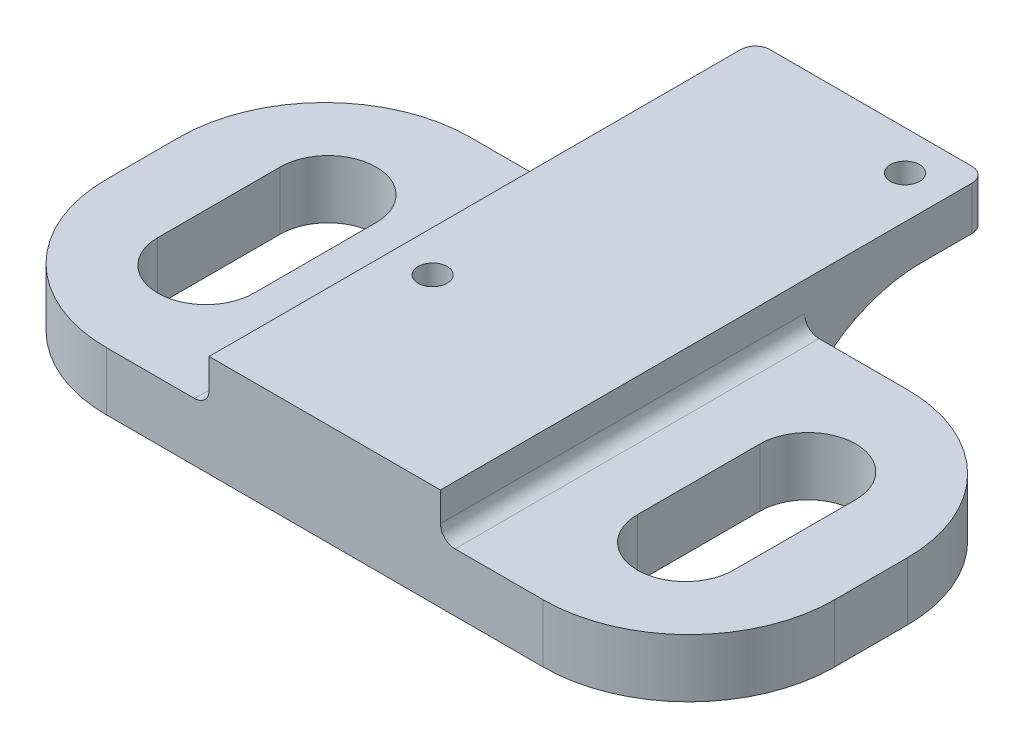
ISO-10303-21;
HEADER;
FILE_DESCRIPTION(('STEP AP214'),'2;1');
FILE_NAME('part.step','',(''),(''),'','','');
FILE_SCHEMA(('AUTOMOTIVE_DESIGN { 1 0 10303 214 1 1 1 1 }'));
ENDSEC;
DATA;
#1=APPLICATION_CONTEXT('core data for automotive mechanical design processes');
#2=APPLICATION_PROTOCOL_DEFINITION('international standard','automotive_design',2000,#1);
#3=PRODUCT_CONTEXT('',#1,'mechanical');
#4=PRODUCT('Part','Part','',(#3));
#5=PRODUCT_RELATED_PRODUCT_CATEGORY('part','',(#4));
#6=PRODUCT_DEFINITION_FORMATION('','',#4);
#7=PRODUCT_DEFINITION_CONTEXT('part definition',#1,'design');
#8=PRODUCT_DEFINITION('design','',#6,#7);
#9=PRODUCT_DEFINITION_SHAPE('','',#8);
#10=(LENGTH_UNIT() NAMED_UNIT(*) SI_UNIT(.MILLI.,.METRE.));
#11=(NAMED_UNIT(*) PLANE_ANGLE_UNIT() SI_UNIT($,.RADIAN.));
#12=(NAMED_UNIT(*) SI_UNIT($,.STERADIAN.) SOLID_ANGLE_UNIT());
#13=UNCERTAINTY_MEASURE_WITH_UNIT(LENGTH_MEASURE(1.E-05),#10,'distance_accuracy_value','');
#14=(GEOMETRIC_REPRESENTATION_CONTEXT(3) GLOBAL_UNCERTAINTY_ASSIGNED_CONTEXT((#13)) GLOBAL_UNIT_ASSIGNED_CONTEXT((#10,
#11,#12)) REPRESENTATION_CONTEXT('',''));
#15=CARTESIAN_POINT('',(0.,0.,0.));
#16=DIRECTION('',(0.,0.,1.));
#17=DIRECTION('',(1.,0.,0.));
#18=AXIS2_PLACEMENT_3D('',#15,#16,#17);
#19=CARTESIAN_POINT('',(0.,4.,-25.));
#20=DIRECTION('',(0.,0.,1.));
#21=DIRECTION('',(1.,0.,0.));
#22=AXIS2_PLACEMENT_3D('',#19,#20,#21);
#23=PLANE('',#22);
#24=DIRECTION('',(-1.,0.,0.));
#25=VECTOR('',#24,1.);
#26=CARTESIAN_POINT('',(0.,4.,-25.));
#27=LINE('',#26,#25);
#28=CARTESIAN_POINT('',(16.06,4.,-25.));
#29=VERTEX_POINT('',#28);
#30=CARTESIAN_POINT('',(10.,4.,-25.));
#31=VERTEX_POINT('',#30);
#32=EDGE_CURVE('E452',#29,#31,#27,.T.);
#33=ORIENTED_EDGE('',*,*,#32,.F.);
#34=CARTESIAN_POINT('',(16.06,5.,-25.));
#35=DIRECTION('',(0.,0.,1.));
#36=DIRECTION('',(1.,0.,0.));
#37=AXIS2_PLACEMENT_3D('',#34,#35,#36);
#38=CIRCLE('',#37,1.);
#39=CARTESIAN_POINT('',(17.06,5.,-25.));
#40=VERTEX_POINT('',#39);
#41=EDGE_CURVE('E13',#29,#40,#38,.T.);
#42=ORIENTED_EDGE('',*,*,#41,.T.);
#43=DIRECTION('',(0.,-1.,0.));
#44=VECTOR('',#43,1.);
#45=CARTESIAN_POINT('',(17.06,7.,-25.));
#46=LINE('',#45,#44);
#47=CARTESIAN_POINT('',(17.06,0.,-25.));
#48=VERTEX_POINT('',#47);
#49=EDGE_CURVE('E529',#40,#48,#46,.T.);
#50=ORIENTED_EDGE('',*,*,#49,.T.);
#51=DIRECTION('',(-1.,0.,0.));
#52=VECTOR('',#51,1.);
#53=CARTESIAN_POINT('',(0.,0.,-25.));
#54=LINE('',#53,#52);
#55=CARTESIAN_POINT('',(10.,0.,-25.));
#56=VERTEX_POINT('',#55);
#57=EDGE_CURVE('E465',#48,#56,#54,.T.);
#58=ORIENTED_EDGE('',*,*,#57,.T.);
#59=DIRECTION('',(0.,-1.,0.));
#60=VECTOR('',#59,1.);
#61=CARTESIAN_POINT('',(10.,4.,-25.));
#62=LINE('',#61,#60);
#63=EDGE_CURVE('E485',#56,#31,#62,.F.);
#64=ORIENTED_EDGE('',*,*,#63,.T.);
#65=EDGE_LOOP('',(#33,#42,#50,#58,#64));
#66=FACE_BOUND('',#65,.T.);
#67=ADVANCED_FACE('F181',(#66),#23,.F.);
#68=CARTESIAN_POINT('',(0.,4.,0.));
#69=DIRECTION('',(0.,-1.,0.));
#70=DIRECTION('',(0.,0.,-1.));
#71=AXIS2_PLACEMENT_3D('',#68,#69,#70);
#72=PLANE('',#71);
#73=DIRECTION('',(1.,0.,0.));
#74=VECTOR('',#73,1.);
#75=CARTESIAN_POINT('',(0.,4.,0.));
#76=LINE('',#75,#74);
#77=CARTESIAN_POINT('',(10.,4.,0.));
#78=VERTEX_POINT('',#77);
#79=CARTESIAN_POINT('',(16.06,4.,0.));
#80=VERTEX_POINT('',#79);
#81=EDGE_CURVE('E446',#78,#80,#76,.T.);
#82=ORIENTED_EDGE('',*,*,#81,.T.);
#83=DIRECTION('',(0.,0.,1.));
#84=VECTOR('',#83,1.);
#85=CARTESIAN_POINT('',(16.06,4.,-25.));
#86=LINE('',#85,#84);
#87=EDGE_CURVE('E549',#80,#29,#86,.F.);
#88=ORIENTED_EDGE('',*,*,#87,.T.);
#89=ORIENTED_EDGE('',*,*,#32,.T.);
#90=CARTESIAN_POINT('',(10.,4.,-15.));
#91=DIRECTION('',(0.,-1.,0.));
#92=DIRECTION('',(0.,0.,-1.));
#93=AXIS2_PLACEMENT_3D('',#90,#91,#92);
#94=CIRCLE('',#93,10.);
#95=CARTESIAN_POINT('',(0.,4.,-15.));
#96=VERTEX_POINT('',#95);
#97=EDGE_CURVE('E520',#31,#96,#94,.F.);
#98=ORIENTED_EDGE('',*,*,#97,.T.);
#99=DIRECTION('',(0.,0.,1.));
#100=VECTOR('',#99,1.);
#101=CARTESIAN_POINT('',(0.,4.,0.));
#102=LINE('',#101,#100);
#103=CARTESIAN_POINT('',(0.,4.,-10.));
#104=VERTEX_POINT('',#103);
#105=EDGE_CURVE('E441',#96,#104,#102,.T.);
#106=ORIENTED_EDGE('',*,*,#105,.T.);
#107=CARTESIAN_POINT('',(10.,4.,-10.));
#108=DIRECTION('',(0.,-1.,0.));
#109=DIRECTION('',(0.,0.,-1.));
#110=AXIS2_PLACEMENT_3D('',#107,#108,#109);
#111=CIRCLE('',#110,10.);
#112=EDGE_CURVE('E522',#104,#78,#111,.F.);
#113=ORIENTED_EDGE('',*,*,#112,.T.);
#114=EDGE_LOOP('',(#82,#88,#89,#98,#106,#113));
#115=FACE_BOUND('',#114,.T.);
#116=DIRECTION('',(0.,0.,-1.));
#117=VECTOR('',#116,1.);
#118=CARTESIAN_POINT('',(11.83,4.,-8.3));
#119=LINE('',#118,#117);
#120=CARTESIAN_POINT('',(11.83,4.,-8.3));
#121=VERTEX_POINT('',#120);
#122=CARTESIAN_POINT('',(11.83,4.,-16.7));
#123=VERTEX_POINT('',#122);
#124=EDGE_CURVE('E387',#121,#123,#119,.T.);
#125=ORIENTED_EDGE('',*,*,#124,.F.);
#126=CARTESIAN_POINT('',(8.53,4.,-8.3));
#127=DIRECTION('',(0.,1.,0.));
#128=DIRECTION('',(0.,0.,1.));
#129=AXIS2_PLACEMENT_3D('',#126,#127,#128);
#130=CIRCLE('',#129,3.3);
#131=CARTESIAN_POINT('',(5.22999999999998,4.,-8.3));
#132=VERTEX_POINT('',#131);
#133=EDGE_CURVE('E385',#132,#121,#130,.T.);
#134=ORIENTED_EDGE('',*,*,#133,.F.);
#135=DIRECTION('',(0.,0.,-1.));
#136=VECTOR('',#135,1.);
#137=CARTESIAN_POINT('',(5.23,4.,-8.3));
#138=LINE('',#137,#136);
#139=CARTESIAN_POINT('',(5.23,4.,-16.7));
#140=VERTEX_POINT('',#139);
#141=EDGE_CURVE('E367',#132,#140,#138,.T.);
#142=ORIENTED_EDGE('',*,*,#141,.T.);
#143=CARTESIAN_POINT('',(8.53,4.,-16.7));
#144=DIRECTION('',(0.,1.,0.));
#145=DIRECTION('',(0.,0.,1.));
#146=AXIS2_PLACEMENT_3D('',#143,#144,#145);
#147=CIRCLE('',#146,3.3);
#148=EDGE_CURVE('E374',#123,#140,#147,.T.);
#149=ORIENTED_EDGE('',*,*,#148,.F.);
#150=EDGE_LOOP('',(#125,#134,#142,#149));
#151=FACE_BOUND('',#150,.T.);
#152=ADVANCED_FACE('F384',(#115,#151),#72,.F.);
#153=CARTESIAN_POINT('',(40.,4.,-25.));
#154=VERTEX_POINT('',#153);
#155=CARTESIAN_POINT('',(33.94,4.,-25.));
#156=VERTEX_POINT('',#155);
#157=EDGE_CURVE('E453',#154,#156,#27,.T.);
#158=ORIENTED_EDGE('',*,*,#157,.T.);
#159=DIRECTION('',(0.,0.,-1.));
#160=VECTOR('',#159,1.);
#161=CARTESIAN_POINT('',(33.94,4.,0.));
#162=LINE('',#161,#160);
#163=CARTESIAN_POINT('',(33.94,4.,0.));
#164=VERTEX_POINT('',#163);
#165=EDGE_CURVE('E541',#156,#164,#162,.F.);
#166=ORIENTED_EDGE('',*,*,#165,.T.);
#167=CARTESIAN_POINT('',(40.,4.,0.));
#168=VERTEX_POINT('',#167);
#169=EDGE_CURVE('E444',#164,#168,#76,.T.);
#170=ORIENTED_EDGE('',*,*,#169,.T.);
#171=CARTESIAN_POINT('',(40.,4.,-10.));
#172=DIRECTION('',(0.,-1.,0.));
#173=DIRECTION('',(0.,0.,-1.));
#174=AXIS2_PLACEMENT_3D('',#171,#172,#173);
#175=CIRCLE('',#174,10.);
#176=CARTESIAN_POINT('',(50.,4.,-10.));
#177=VERTEX_POINT('',#176);
#178=EDGE_CURVE('E505',#168,#177,#175,.F.);
#179=ORIENTED_EDGE('',*,*,#178,.T.);
#180=DIRECTION('',(0.,0.,-1.));
#181=VECTOR('',#180,1.);
#182=CARTESIAN_POINT('',(50.,4.,0.));
#183=LINE('',#182,#181);
#184=CARTESIAN_POINT('',(50.,4.,-15.));
#185=VERTEX_POINT('',#184);
#186=EDGE_CURVE('E449',#177,#185,#183,.T.);
#187=ORIENTED_EDGE('',*,*,#186,.T.);
#188=CARTESIAN_POINT('',(40.,4.,-15.));
#189=DIRECTION('',(0.,-1.,0.));
#190=DIRECTION('',(0.,0.,-1.));
#191=AXIS2_PLACEMENT_3D('',#188,#189,#190);
#192=CIRCLE('',#191,10.);
#193=EDGE_CURVE('E507',#185,#154,#192,.F.);
#194=ORIENTED_EDGE('',*,*,#193,.T.);
#195=EDGE_LOOP('',(#158,#166,#170,#179,#187,#194));
#196=FACE_BOUND('',#195,.T.);
#197=DIRECTION('',(0.,0.,-1.));
#198=VECTOR('',#197,1.);
#199=CARTESIAN_POINT('',(44.77,4.,-8.3));
#200=LINE('',#199,#198);
#201=CARTESIAN_POINT('',(44.77,4.,-8.3));
#202=VERTEX_POINT('',#201);
#203=CARTESIAN_POINT('',(44.77,4.,-16.7));
#204=VERTEX_POINT('',#203);
#205=EDGE_CURVE('E373',#202,#204,#200,.T.);
#206=ORIENTED_EDGE('',*,*,#205,.F.);
#207=CARTESIAN_POINT('',(41.47,4.,-8.3));
#208=DIRECTION('',(0.,1.,0.));
#209=DIRECTION('',(0.,0.,1.));
#210=AXIS2_PLACEMENT_3D('',#207,#208,#209);
#211=CIRCLE('',#210,3.3);
#212=CARTESIAN_POINT('',(38.17,4.,-8.3));
#213=VERTEX_POINT('',#212);
#214=EDGE_CURVE('E406',#213,#202,#211,.T.);
#215=ORIENTED_EDGE('',*,*,#214,.F.);
#216=DIRECTION('',(0.,0.,-1.));
#217=VECTOR('',#216,1.);
#218=CARTESIAN_POINT('',(38.17,4.,-8.3));
#219=LINE('',#218,#217);
#220=CARTESIAN_POINT('',(38.17,4.,-16.7));
#221=VERTEX_POINT('',#220);
#222=EDGE_CURVE('E400',#213,#221,#219,.T.);
#223=ORIENTED_EDGE('',*,*,#222,.T.);
#224=CARTESIAN_POINT('',(41.47,4.,-16.7));
#225=DIRECTION('',(0.,1.,0.));
#226=DIRECTION('',(0.,0.,1.));
#227=AXIS2_PLACEMENT_3D('',#224,#225,#226);
#228=CIRCLE('',#227,3.3);
#229=EDGE_CURVE('E414',#204,#221,#228,.T.);
#230=ORIENTED_EDGE('',*,*,#229,.F.);
#231=EDGE_LOOP('',(#206,#215,#223,#230));
#232=FACE_BOUND('',#231,.T.);
#233=ADVANCED_FACE('F611',(#196,#232),#72,.F.);
#234=CARTESIAN_POINT('',(0.,4.,0.));
#235=DIRECTION('',(1.,0.,0.));
#236=DIRECTION('',(0.,0.,-1.));
#237=AXIS2_PLACEMENT_3D('',#234,#235,#236);
#238=PLANE('',#237);
#239=DIRECTION('',(0.,0.,1.));
#240=VECTOR('',#239,1.);
#241=CARTESIAN_POINT('',(0.,0.,0.));
#242=LINE('',#241,#240);
#243=CARTESIAN_POINT('',(0.,0.,-15.));
#244=VERTEX_POINT('',#243);
#245=CARTESIAN_POINT('',(0.,0.,-10.));
#246=VERTEX_POINT('',#245);
#247=EDGE_CURVE('E440',#244,#246,#242,.T.);
#248=ORIENTED_EDGE('',*,*,#247,.T.);
#249=DIRECTION('',(0.,-1.,0.));
#250=VECTOR('',#249,1.);
#251=CARTESIAN_POINT('',(0.,4.,-10.));
#252=LINE('',#251,#250);
#253=EDGE_CURVE('E518',#246,#104,#252,.F.);
#254=ORIENTED_EDGE('',*,*,#253,.T.);
#255=ORIENTED_EDGE('',*,*,#105,.F.);
#256=DIRECTION('',(0.,-1.,0.));
#257=VECTOR('',#256,1.);
#258=CARTESIAN_POINT('',(0.,4.,-15.));
#259=LINE('',#258,#257);
#260=EDGE_CURVE('E515',#96,#244,#259,.T.);
#261=ORIENTED_EDGE('',*,*,#260,.T.);
#262=EDGE_LOOP('',(#248,#254,#255,#261));
#263=FACE_BOUND('',#262,.T.);
#264=ADVANCED_FACE('F587',(#263),#238,.F.);
#265=CARTESIAN_POINT('',(0.,4.,0.));
#266=DIRECTION('',(0.,0.,-1.));
#267=DIRECTION('',(-1.,0.,0.));
#268=AXIS2_PLACEMENT_3D('',#265,#266,#267);
#269=PLANE('',#268);
#270=DIRECTION('',(1.,0.,0.));
#271=VECTOR('',#270,1.);
#272=CARTESIAN_POINT('',(0.,0.,0.));
#273=LINE('',#272,#271);
#274=CARTESIAN_POINT('',(10.,0.,0.));
#275=VERTEX_POINT('',#274);
#276=CARTESIAN_POINT('',(40.,0.,0.));
#277=VERTEX_POINT('',#276);
#278=EDGE_CURVE('E459',#275,#277,#273,.T.);
#279=ORIENTED_EDGE('',*,*,#278,.T.);
#280=DIRECTION('',(0.,-1.,0.));
#281=VECTOR('',#280,1.);
#282=CARTESIAN_POINT('',(40.,4.,0.));
#283=LINE('',#282,#281);
#284=EDGE_CURVE('E512',#277,#168,#283,.F.);
#285=ORIENTED_EDGE('',*,*,#284,.T.);
#286=ORIENTED_EDGE('',*,*,#169,.F.);
#287=CARTESIAN_POINT('',(33.94,5.,0.));
#288=DIRECTION('',(0.,0.,-1.));
#289=DIRECTION('',(-1.,0.,0.));
#290=AXIS2_PLACEMENT_3D('',#287,#288,#289);
#291=CIRCLE('',#290,1.);
#292=CARTESIAN_POINT('',(32.94,5.,0.));
#293=VERTEX_POINT('',#292);
#294=EDGE_CURVE('E564',#164,#293,#291,.T.);
#295=ORIENTED_EDGE('',*,*,#294,.T.);
#296=DIRECTION('',(0.,-1.,0.));
#297=VECTOR('',#296,1.);
#298=CARTESIAN_POINT('',(32.94,7.,0.));
#299=LINE('',#298,#297);
#300=CARTESIAN_POINT('',(32.94,7.,0.));
#301=VERTEX_POINT('',#300);
#302=EDGE_CURVE('E429',#301,#293,#299,.T.);
#303=ORIENTED_EDGE('',*,*,#302,.F.);
#304=DIRECTION('',(1.,0.,0.));
#305=VECTOR('',#304,1.);
#306=CARTESIAN_POINT('',(17.06,7.,0.));
#307=LINE('',#306,#305);
#308=CARTESIAN_POINT('',(17.06,7.,0.));
#309=VERTEX_POINT('',#308);
#310=EDGE_CURVE('E422',#309,#301,#307,.T.);
#311=ORIENTED_EDGE('',*,*,#310,.F.);
#312=DIRECTION('',(0.,-1.,0.));
#313=VECTOR('',#312,1.);
#314=CARTESIAN_POINT('',(17.06,7.,0.));
#315=LINE('',#314,#313);
#316=CARTESIAN_POINT('',(17.06,5.,0.));
#317=VERTEX_POINT('',#316);
#318=EDGE_CURVE('E437',#309,#317,#315,.T.);
#319=ORIENTED_EDGE('',*,*,#318,.T.);
#320=CARTESIAN_POINT('',(16.06,5.,0.));
#321=DIRECTION('',(0.,0.,-1.));
#322=DIRECTION('',(-1.,0.,0.));
#323=AXIS2_PLACEMENT_3D('',#320,#321,#322);
#324=CIRCLE('',#323,1.);
#325=EDGE_CURVE('E189',#317,#80,#324,.T.);
#326=ORIENTED_EDGE('',*,*,#325,.T.);
#327=ORIENTED_EDGE('',*,*,#81,.F.);
#328=DIRECTION('',(0.,-1.,0.));
#329=VECTOR('',#328,1.);
#330=CARTESIAN_POINT('',(10.,4.,0.));
#331=LINE('',#330,#329);
#332=EDGE_CURVE('E509',#78,#275,#331,.T.);
#333=ORIENTED_EDGE('',*,*,#332,.T.);
#334=EDGE_LOOP('',(#279,#285,#286,#295,#303,#311,#319,#326,#327,#333));
#335=FACE_BOUND('',#334,.T.);
#336=ADVANCED_FACE('F567',(#335),#269,.F.);
#337=CARTESIAN_POINT('',(50.,4.,0.));
#338=DIRECTION('',(-1.,0.,0.));
#339=DIRECTION('',(0.,0.,1.));
#340=AXIS2_PLACEMENT_3D('',#337,#338,#339);
#341=PLANE('',#340);
#342=DIRECTION('',(0.,0.,-1.));
#343=VECTOR('',#342,1.);
#344=CARTESIAN_POINT('',(50.,0.,0.));
#345=LINE('',#344,#343);
#346=CARTESIAN_POINT('',(50.,0.,-10.));
#347=VERTEX_POINT('',#346);
#348=CARTESIAN_POINT('',(50.,0.,-15.));
#349=VERTEX_POINT('',#348);
#350=EDGE_CURVE('E462',#347,#349,#345,.T.);
#351=ORIENTED_EDGE('',*,*,#350,.T.);
#352=DIRECTION('',(0.,-1.,0.));
#353=VECTOR('',#352,1.);
#354=CARTESIAN_POINT('',(50.,4.,-15.));
#355=LINE('',#354,#353);
#356=EDGE_CURVE('E503',#349,#185,#355,.F.);
#357=ORIENTED_EDGE('',*,*,#356,.T.);
#358=ORIENTED_EDGE('',*,*,#186,.F.);
#359=DIRECTION('',(0.,-1.,0.));
#360=VECTOR('',#359,1.);
#361=CARTESIAN_POINT('',(50.,4.,-10.));
#362=LINE('',#361,#360);
#363=EDGE_CURVE('E500',#177,#347,#362,.T.);
#364=ORIENTED_EDGE('',*,*,#363,.T.);
#365=EDGE_LOOP('',(#351,#357,#358,#364));
#366=FACE_BOUND('',#365,.T.);
#367=ADVANCED_FACE('F607',(#366),#341,.F.);
#368=CARTESIAN_POINT('',(40.,0.,-25.));
#369=VERTEX_POINT('',#368);
#370=CARTESIAN_POINT('',(32.94,0.,-25.));
#371=VERTEX_POINT('',#370);
#372=EDGE_CURVE('E445',#369,#371,#54,.T.);
#373=ORIENTED_EDGE('',*,*,#372,.T.);
#374=DIRECTION('',(0.,1.,0.));
#375=VECTOR('',#374,1.);
#376=CARTESIAN_POINT('',(32.94,7.,-25.));
#377=LINE('',#376,#375);
#378=CARTESIAN_POINT('',(32.94,5.,-25.));
#379=VERTEX_POINT('',#378);
#380=EDGE_CURVE('E527',#371,#379,#377,.T.);
#381=ORIENTED_EDGE('',*,*,#380,.T.);
#382=CARTESIAN_POINT('',(33.94,5.,-25.));
#383=DIRECTION('',(0.,0.,1.));
#384=DIRECTION('',(1.,0.,0.));
#385=AXIS2_PLACEMENT_3D('',#382,#383,#384);
#386=CIRCLE('',#385,1.);
#387=EDGE_CURVE('E562',#379,#156,#386,.T.);
#388=ORIENTED_EDGE('',*,*,#387,.T.);
#389=ORIENTED_EDGE('',*,*,#157,.F.);
#390=DIRECTION('',(0.,-1.,0.));
#391=VECTOR('',#390,1.);
#392=CARTESIAN_POINT('',(40.,4.,-25.));
#393=LINE('',#392,#391);
#394=EDGE_CURVE('E488',#154,#369,#393,.T.);
#395=ORIENTED_EDGE('',*,*,#394,.T.);
#396=EDGE_LOOP('',(#373,#381,#388,#389,#395));
#397=FACE_BOUND('',#396,.T.);
#398=ADVANCED_FACE('F618',(#397),#23,.F.);
#399=CARTESIAN_POINT('',(0.,0.,0.));
#400=DIRECTION('',(0.,-1.,0.));
#401=DIRECTION('',(0.,0.,-1.));
#402=AXIS2_PLACEMENT_3D('',#399,#400,#401);
#403=PLANE('',#402);
#404=CARTESIAN_POINT('',(19.8800000000001,0.,-12.5250000000001));
#405=DIRECTION('',(0.,-1.,0.));
#406=DIRECTION('',(0.,0.,-1.));
#407=AXIS2_PLACEMENT_3D('',#404,#405,#406);
#408=CIRCLE('',#407,0.999999999999999);
#409=CARTESIAN_POINT('',(19.8800000000001,0.,-13.5250000000001));
#410=VERTEX_POINT('',#409);
#411=EDGE_CURVE('E390',#410,#410,#408,.T.);
#412=ORIENTED_EDGE('',*,*,#411,.F.);
#413=EDGE_LOOP('',(#412));
#414=FACE_BOUND('',#413,.T.);
#415=DIRECTION('',(0.,0.,-1.));
#416=VECTOR('',#415,1.);
#417=CARTESIAN_POINT('',(5.23000000000001,0.,0.));
#418=LINE('',#417,#416);
#419=CARTESIAN_POINT('',(5.23,0.,-8.3));
#420=VERTEX_POINT('',#419);
#421=CARTESIAN_POINT('',(5.23,0.,-16.7));
#422=VERTEX_POINT('',#421);
#423=EDGE_CURVE('E370',#420,#422,#418,.T.);
#424=ORIENTED_EDGE('',*,*,#423,.F.);
#425=CARTESIAN_POINT('',(8.53,0.,-8.3));
#426=DIRECTION('',(0.,-1.,0.));
#427=DIRECTION('',(0.,0.,-1.));
#428=AXIS2_PLACEMENT_3D('',#425,#426,#427);
#429=CIRCLE('',#428,3.3);
#430=CARTESIAN_POINT('',(11.83,0.,-8.3));
#431=VERTEX_POINT('',#430);
#432=EDGE_CURVE('E480',#431,#420,#429,.T.);
#433=ORIENTED_EDGE('',*,*,#432,.F.);
#434=DIRECTION('',(0.,0.,1.));
#435=VECTOR('',#434,1.);
#436=CARTESIAN_POINT('',(11.83,0.,0.));
#437=LINE('',#436,#435);
#438=CARTESIAN_POINT('',(11.83,0.,-16.7));
#439=VERTEX_POINT('',#438);
#440=EDGE_CURVE('E477',#439,#431,#437,.T.);
#441=ORIENTED_EDGE('',*,*,#440,.F.);
#442=CARTESIAN_POINT('',(8.53,0.,-16.7));
#443=DIRECTION('',(0.,-1.,0.));
#444=DIRECTION('',(0.,0.,-1.));
#445=AXIS2_PLACEMENT_3D('',#442,#443,#444);
#446=CIRCLE('',#445,3.3);
#447=EDGE_CURVE('E482',#422,#439,#446,.T.);
#448=ORIENTED_EDGE('',*,*,#447,.F.);
#449=EDGE_LOOP('',(#424,#433,#441,#448));
#450=FACE_BOUND('',#449,.T.);
#451=DIRECTION('',(0.,0.,-1.));
#452=VECTOR('',#451,1.);
#453=CARTESIAN_POINT('',(38.17,0.,0.));
#454=LINE('',#453,#452);
#455=CARTESIAN_POINT('',(38.17,0.,-8.3));
#456=VERTEX_POINT('',#455);
#457=CARTESIAN_POINT('',(38.17,0.,-16.7));
#458=VERTEX_POINT('',#457);
#459=EDGE_CURVE('E474',#456,#458,#454,.T.);
#460=ORIENTED_EDGE('',*,*,#459,.F.);
#461=CARTESIAN_POINT('',(41.47,0.,-8.3));
#462=DIRECTION('',(0.,-1.,0.));
#463=DIRECTION('',(0.,0.,-1.));
#464=AXIS2_PLACEMENT_3D('',#461,#462,#463);
#465=CIRCLE('',#464,3.3);
#466=CARTESIAN_POINT('',(44.77,0.,-8.3));
#467=VERTEX_POINT('',#466);
#468=EDGE_CURVE('E470',#467,#456,#465,.T.);
#469=ORIENTED_EDGE('',*,*,#468,.F.);
#470=DIRECTION('',(0.,0.,1.));
#471=VECTOR('',#470,1.);
#472=CARTESIAN_POINT('',(44.77,0.,0.));
#473=LINE('',#472,#471);
#474=CARTESIAN_POINT('',(44.77,0.,-16.7));
#475=VERTEX_POINT('',#474);
#476=EDGE_CURVE('E456',#475,#467,#473,.T.);
#477=ORIENTED_EDGE('',*,*,#476,.F.);
#478=CARTESIAN_POINT('',(41.47,0.,-16.7));
#479=DIRECTION('',(0.,-1.,0.));
#480=DIRECTION('',(0.,0.,-1.));
#481=AXIS2_PLACEMENT_3D('',#478,#479,#480);
#482=CIRCLE('',#481,3.3);
#483=EDGE_CURVE('E472',#458,#475,#482,.T.);
#484=ORIENTED_EDGE('',*,*,#483,.F.);
#485=EDGE_LOOP('',(#460,#469,#477,#484));
#486=FACE_BOUND('',#485,.T.);
#487=ORIENTED_EDGE('',*,*,#372,.F.);
#488=CARTESIAN_POINT('',(40.,0.,-15.));
#489=DIRECTION('',(0.,-1.,0.));
#490=DIRECTION('',(0.,0.,-1.));
#491=AXIS2_PLACEMENT_3D('',#488,#489,#490);
#492=CIRCLE('',#491,10.);
#493=EDGE_CURVE('E498',#369,#349,#492,.T.);
#494=ORIENTED_EDGE('',*,*,#493,.T.);
#495=ORIENTED_EDGE('',*,*,#350,.F.);
#496=CARTESIAN_POINT('',(40.,0.,-10.));
#497=DIRECTION('',(0.,-1.,0.));
#498=DIRECTION('',(0.,0.,-1.));
#499=AXIS2_PLACEMENT_3D('',#496,#497,#498);
#500=CIRCLE('',#499,10.);
#501=EDGE_CURVE('E496',#347,#277,#500,.T.);
#502=ORIENTED_EDGE('',*,*,#501,.T.);
#503=ORIENTED_EDGE('',*,*,#278,.F.);
#504=CARTESIAN_POINT('',(10.,0.,-10.));
#505=DIRECTION('',(0.,-1.,0.));
#506=DIRECTION('',(0.,0.,-1.));
#507=AXIS2_PLACEMENT_3D('',#504,#505,#506);
#508=CIRCLE('',#507,10.);
#509=EDGE_CURVE('E494',#275,#246,#508,.T.);
#510=ORIENTED_EDGE('',*,*,#509,.T.);
#511=ORIENTED_EDGE('',*,*,#247,.F.);
#512=CARTESIAN_POINT('',(10.,0.,-15.));
#513=DIRECTION('',(0.,-1.,0.));
#514=DIRECTION('',(0.,0.,-1.));
#515=AXIS2_PLACEMENT_3D('',#512,#513,#514);
#516=CIRCLE('',#515,10.);
#517=EDGE_CURVE('E491',#244,#56,#516,.T.);
#518=ORIENTED_EDGE('',*,*,#517,.T.);
#519=ORIENTED_EDGE('',*,*,#57,.F.);
#520=EDGE_CURVE('E468',#371,#48,#54,.T.);
#521=ORIENTED_EDGE('',*,*,#520,.F.);
#522=EDGE_LOOP('',(#487,#494,#495,#502,#503,#510,#511,#518,#519,#521));
#523=FACE_BOUND('',#522,.T.);
#524=ADVANCED_FACE('F593',(#414,#450,#486,#523),#403,.T.);
#525=CARTESIAN_POINT('',(0.,4.,0.));
#526=DIRECTION('',(0.,1.,0.));
#527=DIRECTION('',(0.,0.,1.));
#528=AXIS2_PLACEMENT_3D('',#525,#526,#527);
#529=PLANE('',#528);
#530=CARTESIAN_POINT('',(30.0400000000001,4.,-34.8000000000001));
#531=DIRECTION('',(0.,1.,0.));
#532=DIRECTION('',(0.,0.,1.));
#533=AXIS2_PLACEMENT_3D('',#530,#531,#532);
#534=CIRCLE('',#533,0.999999999999999);
#535=CARTESIAN_POINT('',(30.0400000000001,4.,-33.8000000000001));
#536=VERTEX_POINT('',#535);
#537=EDGE_CURVE('E929',#536,#536,#534,.T.);
#538=ORIENTED_EDGE('',*,*,#537,.T.);
#539=EDGE_LOOP('',(#538));
#540=FACE_BOUND('',#539,.T.);
#541=DIRECTION('',(-1.,0.,0.));
#542=VECTOR('',#541,1.);
#543=CARTESIAN_POINT('',(17.06,4.,-37.5));
#544=LINE('',#543,#542);
#545=CARTESIAN_POINT('',(31.94,4.,-37.5));
#546=VERTEX_POINT('',#545);
#547=CARTESIAN_POINT('',(18.06,4.,-37.5));
#548=VERTEX_POINT('',#547);
#549=EDGE_CURVE('E423',#546,#548,#544,.T.);
#550=ORIENTED_EDGE('',*,*,#549,.F.);
#551=CARTESIAN_POINT('',(31.94,4.,-36.5));
#552=DIRECTION('',(0.,1.,0.));
#553=DIRECTION('',(0.,0.,1.));
#554=AXIS2_PLACEMENT_3D('',#551,#552,#553);
#555=CIRCLE('',#554,1.);
#556=CARTESIAN_POINT('',(32.94,4.,-36.5));
#557=VERTEX_POINT('',#556);
#558=EDGE_CURVE('E557',#546,#557,#555,.F.);
#559=ORIENTED_EDGE('',*,*,#558,.T.);
#560=DIRECTION('',(0.,0.,-1.));
#561=VECTOR('',#560,1.);
#562=CARTESIAN_POINT('',(32.94,4.,-37.5));
#563=LINE('',#562,#561);
#564=CARTESIAN_POINT('',(32.94,4.,-33.));
#565=VERTEX_POINT('',#564);
#566=EDGE_CURVE('E431',#565,#557,#563,.T.);
#567=ORIENTED_EDGE('',*,*,#566,.F.);
#568=DIRECTION('',(1.,0.,0.));
#569=VECTOR('',#568,1.);
#570=CARTESIAN_POINT('',(0.,4.,-33.));
#571=LINE('',#570,#569);
#572=CARTESIAN_POINT('',(17.06,4.,-33.));
#573=VERTEX_POINT('',#572);
#574=EDGE_CURVE('E524',#565,#573,#571,.F.);
#575=ORIENTED_EDGE('',*,*,#574,.T.);
#576=DIRECTION('',(0.,0.,1.));
#577=VECTOR('',#576,1.);
#578=CARTESIAN_POINT('',(17.06,4.,-37.5));
#579=LINE('',#578,#577);
#580=CARTESIAN_POINT('',(17.06,4.,-36.5));
#581=VERTEX_POINT('',#580);
#582=EDGE_CURVE('E419',#581,#573,#579,.T.);
#583=ORIENTED_EDGE('',*,*,#582,.F.);
#584=CARTESIAN_POINT('',(18.06,4.,-36.5));
#585=DIRECTION('',(0.,1.,0.));
#586=DIRECTION('',(0.,0.,1.));
#587=AXIS2_PLACEMENT_3D('',#584,#585,#586);
#588=CIRCLE('',#587,1.);
#589=EDGE_CURVE('E555',#581,#548,#588,.F.);
#590=ORIENTED_EDGE('',*,*,#589,.T.);
#591=EDGE_LOOP('',(#550,#559,#567,#575,#583,#590));
#592=FACE_BOUND('',#591,.T.);
#593=ADVANCED_FACE('F630',(#540,#592),#529,.F.);
#594=CARTESIAN_POINT('',(17.06,7.,-37.5));
#595=DIRECTION('',(1.,0.,0.));
#596=DIRECTION('',(0.,0.,-1.));
#597=AXIS2_PLACEMENT_3D('',#594,#595,#596);
#598=PLANE('',#597);
#599=ORIENTED_EDGE('',*,*,#49,.F.);
#600=DIRECTION('',(0.,0.,1.));
#601=VECTOR('',#600,1.);
#602=CARTESIAN_POINT('',(17.06,5.,0.));
#603=LINE('',#602,#601);
#604=EDGE_CURVE('E546',#40,#317,#603,.T.);
#605=ORIENTED_EDGE('',*,*,#604,.T.);
#606=ORIENTED_EDGE('',*,*,#318,.F.);
#607=DIRECTION('',(0.,0.,1.));
#608=VECTOR('',#607,1.);
#609=CARTESIAN_POINT('',(17.06,7.,-37.5));
#610=LINE('',#609,#608);
#611=CARTESIAN_POINT('',(17.06,7.,-36.5));
#612=VERTEX_POINT('',#611);
#613=EDGE_CURVE('E420',#612,#309,#610,.T.);
#614=ORIENTED_EDGE('',*,*,#613,.F.);
#615=DIRECTION('',(0.,-1.,0.));
#616=VECTOR('',#615,1.);
#617=CARTESIAN_POINT('',(17.06,7.,-36.5));
#618=LINE('',#617,#616);
#619=EDGE_CURVE('E543',#612,#581,#618,.T.);
#620=ORIENTED_EDGE('',*,*,#619,.T.);
#621=ORIENTED_EDGE('',*,*,#582,.T.);
#622=CARTESIAN_POINT('',(17.06,-6.,-33.));
#623=DIRECTION('',(1.,0.,0.));
#624=DIRECTION('',(0.,0.,-1.));
#625=AXIS2_PLACEMENT_3D('',#622,#623,#624);
#626=CIRCLE('',#625,10.);
#627=EDGE_CURVE('E532',#573,#48,#626,.T.);
#628=ORIENTED_EDGE('',*,*,#627,.T.);
#629=EDGE_LOOP('',(#599,#605,#606,#614,#620,#621,#628));
#630=FACE_BOUND('',#629,.T.);
#631=ADVANCED_FACE('F642',(#630),#598,.F.);
#632=CARTESIAN_POINT('',(32.94,7.,-37.5));
#633=DIRECTION('',(-1.,0.,0.));
#634=DIRECTION('',(0.,0.,1.));
#635=AXIS2_PLACEMENT_3D('',#632,#633,#634);
#636=PLANE('',#635);
#637=ORIENTED_EDGE('',*,*,#302,.T.);
#638=DIRECTION('',(0.,0.,-1.));
#639=VECTOR('',#638,1.);
#640=CARTESIAN_POINT('',(32.94,5.,-25.));
#641=LINE('',#640,#639);
#642=EDGE_CURVE('E538',#293,#379,#641,.T.);
#643=ORIENTED_EDGE('',*,*,#642,.T.);
#644=ORIENTED_EDGE('',*,*,#380,.F.);
#645=CARTESIAN_POINT('',(32.94,-6.,-33.));
#646=DIRECTION('',(-1.,0.,0.));
#647=DIRECTION('',(0.,0.,1.));
#648=AXIS2_PLACEMENT_3D('',#645,#646,#647);
#649=CIRCLE('',#648,10.);
#650=EDGE_CURVE('E534',#371,#565,#649,.T.);
#651=ORIENTED_EDGE('',*,*,#650,.T.);
#652=ORIENTED_EDGE('',*,*,#566,.T.);
#653=DIRECTION('',(0.,-1.,0.));
#654=VECTOR('',#653,1.);
#655=CARTESIAN_POINT('',(32.94,7.,-36.5));
#656=LINE('',#655,#654);
#657=CARTESIAN_POINT('',(32.94,7.,-36.5));
#658=VERTEX_POINT('',#657);
#659=EDGE_CURVE('E536',#557,#658,#656,.F.);
#660=ORIENTED_EDGE('',*,*,#659,.T.);
#661=DIRECTION('',(0.,0.,-1.));
#662=VECTOR('',#661,1.);
#663=CARTESIAN_POINT('',(32.94,7.,-37.5));
#664=LINE('',#663,#662);
#665=EDGE_CURVE('E425',#301,#658,#664,.T.);
#666=ORIENTED_EDGE('',*,*,#665,.F.);
#667=EDGE_LOOP('',(#637,#643,#644,#651,#652,#660,#666));
#668=FACE_BOUND('',#667,.T.);
#669=ADVANCED_FACE('F626',(#668),#636,.F.);
#670=CARTESIAN_POINT('',(17.06,7.,-37.5));
#671=DIRECTION('',(0.,0.,1.));
#672=DIRECTION('',(1.,0.,0.));
#673=AXIS2_PLACEMENT_3D('',#670,#671,#672);
#674=PLANE('',#673);
#675=DIRECTION('',(-1.,0.,0.));
#676=VECTOR('',#675,1.);
#677=CARTESIAN_POINT('',(17.06,7.,-37.5));
#678=LINE('',#677,#676);
#679=CARTESIAN_POINT('',(31.94,7.,-37.5));
#680=VERTEX_POINT('',#679);
#681=CARTESIAN_POINT('',(18.06,7.,-37.5));
#682=VERTEX_POINT('',#681);
#683=EDGE_CURVE('E427',#680,#682,#678,.T.);
#684=ORIENTED_EDGE('',*,*,#683,.F.);
#685=DIRECTION('',(0.,-1.,0.));
#686=VECTOR('',#685,1.);
#687=CARTESIAN_POINT('',(31.94,7.,-37.5));
#688=LINE('',#687,#686);
#689=EDGE_CURVE('E552',#680,#546,#688,.T.);
#690=ORIENTED_EDGE('',*,*,#689,.T.);
#691=ORIENTED_EDGE('',*,*,#549,.T.);
#692=DIRECTION('',(0.,-1.,0.));
#693=VECTOR('',#692,1.);
#694=CARTESIAN_POINT('',(18.06,7.,-37.5));
#695=LINE('',#694,#693);
#696=EDGE_CURVE('E196',#548,#682,#695,.F.);
#697=ORIENTED_EDGE('',*,*,#696,.T.);
#698=EDGE_LOOP('',(#684,#690,#691,#697));
#699=FACE_BOUND('',#698,.T.);
#700=ADVANCED_FACE('F635',(#699),#674,.F.);
#701=CARTESIAN_POINT('',(0.,7.,0.));
#702=DIRECTION('',(0.,1.,0.));
#703=DIRECTION('',(0.,0.,1.));
#704=AXIS2_PLACEMENT_3D('',#701,#702,#703);
#705=PLANE('',#704);
#706=CARTESIAN_POINT('',(30.0400000000001,7.,-34.8000000000001));
#707=DIRECTION('',(0.,1.,0.));
#708=DIRECTION('',(0.,0.,1.));
#709=AXIS2_PLACEMENT_3D('',#706,#707,#708);
#710=CIRCLE('',#709,1.);
#711=CARTESIAN_POINT('',(30.0400000000001,7.,-33.8000000000001));
#712=VERTEX_POINT('',#711);
#713=EDGE_CURVE('E931',#712,#712,#710,.T.);
#714=ORIENTED_EDGE('',*,*,#713,.F.);
#715=EDGE_LOOP('',(#714));
#716=FACE_BOUND('',#715,.T.);
#717=CARTESIAN_POINT('',(19.8800000000001,7.,-12.5250000000001));
#718=DIRECTION('',(0.,1.,0.));
#719=DIRECTION('',(0.,0.,1.));
#720=AXIS2_PLACEMENT_3D('',#717,#718,#719);
#721=CIRCLE('',#720,1.);
#722=CARTESIAN_POINT('',(19.8800000000001,7.,-11.5250000000001));
#723=VERTEX_POINT('',#722);
#724=EDGE_CURVE('E930',#723,#723,#721,.T.);
#725=ORIENTED_EDGE('',*,*,#724,.F.);
#726=EDGE_LOOP('',(#725));
#727=FACE_BOUND('',#726,.T.);
#728=ORIENTED_EDGE('',*,*,#665,.T.);
#729=CARTESIAN_POINT('',(31.94,7.,-36.5));
#730=DIRECTION('',(0.,1.,0.));
#731=DIRECTION('',(0.,0.,1.));
#732=AXIS2_PLACEMENT_3D('',#729,#730,#731);
#733=CIRCLE('',#732,1.);
#734=EDGE_CURVE('E203',#658,#680,#733,.T.);
#735=ORIENTED_EDGE('',*,*,#734,.T.);
#736=ORIENTED_EDGE('',*,*,#683,.T.);
#737=CARTESIAN_POINT('',(18.06,7.,-36.5));
#738=DIRECTION('',(0.,1.,0.));
#739=DIRECTION('',(0.,0.,1.));
#740=AXIS2_PLACEMENT_3D('',#737,#738,#739);
#741=CIRCLE('',#740,1.);
#742=EDGE_CURVE('E559',#682,#612,#741,.T.);
#743=ORIENTED_EDGE('',*,*,#742,.T.);
#744=ORIENTED_EDGE('',*,*,#613,.T.);
#745=ORIENTED_EDGE('',*,*,#310,.T.);
#746=EDGE_LOOP('',(#728,#735,#736,#743,#744,#745));
#747=FACE_BOUND('',#746,.T.);
#748=ADVANCED_FACE('F637',(#716,#727,#747),#705,.T.);
#749=CARTESIAN_POINT('',(41.47,4.,-16.7));
#750=DIRECTION('',(0.,1.,0.));
#751=DIRECTION('',(0.,0.,1.));
#752=AXIS2_PLACEMENT_3D('',#749,#750,#751);
#753=CYLINDRICAL_SURFACE('',#752,3.3);
#754=ORIENTED_EDGE('',*,*,#483,.T.);
#755=DIRECTION('',(0.,-1.,0.));
#756=VECTOR('',#755,1.);
#757=CARTESIAN_POINT('',(44.77,-0.00100000000000013,-16.7));
#758=LINE('',#757,#756);
#759=EDGE_CURVE('E411',#204,#475,#758,.T.);
#760=ORIENTED_EDGE('',*,*,#759,.F.);
#761=ORIENTED_EDGE('',*,*,#229,.T.);
#762=DIRECTION('',(0.,1.,0.));
#763=VECTOR('',#762,1.);
#764=CARTESIAN_POINT('',(38.17,4.,-16.7));
#765=LINE('',#764,#763);
#766=EDGE_CURVE('E417',#458,#221,#765,.T.);
#767=ORIENTED_EDGE('',*,*,#766,.F.);
#768=EDGE_LOOP('',(#754,#760,#761,#767));
#769=FACE_BOUND('',#768,.T.);
#770=ADVANCED_FACE('F778',(#769),#753,.F.);
#771=CARTESIAN_POINT('',(41.47,4.,-8.3));
#772=DIRECTION('',(0.,1.,0.));
#773=DIRECTION('',(0.,0.,1.));
#774=AXIS2_PLACEMENT_3D('',#771,#772,#773);
#775=CYLINDRICAL_SURFACE('',#774,3.3);
#776=ORIENTED_EDGE('',*,*,#468,.T.);
#777=DIRECTION('',(0.,1.,0.));
#778=VECTOR('',#777,1.);
#779=CARTESIAN_POINT('',(38.17,4.,-8.3));
#780=LINE('',#779,#778);
#781=EDGE_CURVE('E408',#213,#456,#780,.F.);
#782=ORIENTED_EDGE('',*,*,#781,.F.);
#783=ORIENTED_EDGE('',*,*,#214,.T.);
#784=DIRECTION('',(0.,-1.,0.));
#785=VECTOR('',#784,1.);
#786=CARTESIAN_POINT('',(44.77,-0.00100000000000013,-8.3));
#787=LINE('',#786,#785);
#788=EDGE_CURVE('E403',#202,#467,#787,.T.);
#789=ORIENTED_EDGE('',*,*,#788,.T.);
#790=EDGE_LOOP('',(#776,#782,#783,#789));
#791=FACE_BOUND('',#790,.T.);
#792=ADVANCED_FACE('F774',(#791),#775,.F.);
#793=CARTESIAN_POINT('',(38.17,4.,-8.3));
#794=DIRECTION('',(-1.,0.,0.));
#795=DIRECTION('',(0.,0.,1.));
#796=AXIS2_PLACEMENT_3D('',#793,#794,#795);
#797=PLANE('',#796);
#798=ORIENTED_EDGE('',*,*,#459,.T.);
#799=ORIENTED_EDGE('',*,*,#766,.T.);
#800=ORIENTED_EDGE('',*,*,#222,.F.);
#801=ORIENTED_EDGE('',*,*,#781,.T.);
#802=EDGE_LOOP('',(#798,#799,#800,#801));
#803=FACE_BOUND('',#802,.T.);
#804=ADVANCED_FACE('F770',(#803),#797,.F.);
#805=CARTESIAN_POINT('',(44.77,-0.00100000000000013,-8.3));
#806=DIRECTION('',(1.,0.,0.));
#807=DIRECTION('',(0.,1.,0.));
#808=AXIS2_PLACEMENT_3D('',#805,#806,#807);
#809=PLANE('',#808);
#810=ORIENTED_EDGE('',*,*,#476,.T.);
#811=ORIENTED_EDGE('',*,*,#788,.F.);
#812=ORIENTED_EDGE('',*,*,#205,.T.);
#813=ORIENTED_EDGE('',*,*,#759,.T.);
#814=EDGE_LOOP('',(#810,#811,#812,#813));
#815=FACE_BOUND('',#814,.T.);
#816=ADVANCED_FACE('F767',(#815),#809,.F.);
#817=CARTESIAN_POINT('',(8.53,4.,-16.7));
#818=DIRECTION('',(0.,1.,0.));
#819=DIRECTION('',(0.,0.,1.));
#820=AXIS2_PLACEMENT_3D('',#817,#818,#819);
#821=CYLINDRICAL_SURFACE('',#820,3.3);
#822=ORIENTED_EDGE('',*,*,#447,.T.);
#823=DIRECTION('',(0.,-1.,0.));
#824=VECTOR('',#823,1.);
#825=CARTESIAN_POINT('',(11.83,-0.00100000000000013,-16.7));
#826=LINE('',#825,#824);
#827=EDGE_CURVE('E380',#123,#439,#826,.T.);
#828=ORIENTED_EDGE('',*,*,#827,.F.);
#829=ORIENTED_EDGE('',*,*,#148,.T.);
#830=DIRECTION('',(0.,1.,0.));
#831=VECTOR('',#830,1.);
#832=CARTESIAN_POINT('',(5.23,4.,-16.7));
#833=LINE('',#832,#831);
#834=EDGE_CURVE('E362',#422,#140,#833,.T.);
#835=ORIENTED_EDGE('',*,*,#834,.F.);
#836=EDGE_LOOP('',(#822,#828,#829,#835));
#837=FACE_BOUND('',#836,.T.);
#838=ADVANCED_FACE('F378',(#837),#821,.F.);
#839=CARTESIAN_POINT('',(8.53,4.,-8.3));
#840=DIRECTION('',(0.,1.,0.));
#841=DIRECTION('',(0.,0.,1.));
#842=AXIS2_PLACEMENT_3D('',#839,#840,#841);
#843=CYLINDRICAL_SURFACE('',#842,3.3);
#844=ORIENTED_EDGE('',*,*,#432,.T.);
#845=DIRECTION('',(0.,1.,0.));
#846=VECTOR('',#845,1.);
#847=CARTESIAN_POINT('',(5.23,4.,-8.3));
#848=LINE('',#847,#846);
#849=EDGE_CURVE('E395',#132,#420,#848,.F.);
#850=ORIENTED_EDGE('',*,*,#849,.F.);
#851=ORIENTED_EDGE('',*,*,#133,.T.);
#852=DIRECTION('',(0.,-1.,0.));
#853=VECTOR('',#852,1.);
#854=CARTESIAN_POINT('',(11.83,-0.00100000000000013,-8.3));
#855=LINE('',#854,#853);
#856=EDGE_CURVE('E386',#121,#431,#855,.T.);
#857=ORIENTED_EDGE('',*,*,#856,.T.);
#858=EDGE_LOOP('',(#844,#850,#851,#857));
#859=FACE_BOUND('',#858,.T.);
#860=ADVANCED_FACE('F761',(#859),#843,.F.);
#861=CARTESIAN_POINT('',(5.23,4.,-8.3));
#862=DIRECTION('',(-1.,0.,0.));
#863=DIRECTION('',(0.,0.,1.));
#864=AXIS2_PLACEMENT_3D('',#861,#862,#863);
#865=PLANE('',#864);
#866=ORIENTED_EDGE('',*,*,#423,.T.);
#867=ORIENTED_EDGE('',*,*,#834,.T.);
#868=ORIENTED_EDGE('',*,*,#141,.F.);
#869=ORIENTED_EDGE('',*,*,#849,.T.);
#870=EDGE_LOOP('',(#866,#867,#868,#869));
#871=FACE_BOUND('',#870,.T.);
#872=ADVANCED_FACE('F364',(#871),#865,.F.);
#873=CARTESIAN_POINT('',(11.83,-0.00100000000000013,-8.3));
#874=DIRECTION('',(1.,0.,0.));
#875=DIRECTION('',(0.,0.,-1.));
#876=AXIS2_PLACEMENT_3D('',#873,#874,#875);
#877=PLANE('',#876);
#878=ORIENTED_EDGE('',*,*,#440,.T.);
#879=ORIENTED_EDGE('',*,*,#856,.F.);
#880=ORIENTED_EDGE('',*,*,#124,.T.);
#881=ORIENTED_EDGE('',*,*,#827,.T.);
#882=EDGE_LOOP('',(#878,#879,#880,#881));
#883=FACE_BOUND('',#882,.T.);
#884=ADVANCED_FACE('F687',(#883),#877,.F.);
#885=CARTESIAN_POINT('',(40.,4.,-15.));
#886=DIRECTION('',(0.,-1.,0.));
#887=DIRECTION('',(0.,0.,-1.));
#888=AXIS2_PLACEMENT_3D('',#885,#886,#887);
#889=CYLINDRICAL_SURFACE('',#888,10.);
#890=ORIENTED_EDGE('',*,*,#193,.F.);
#891=ORIENTED_EDGE('',*,*,#356,.F.);
#892=ORIENTED_EDGE('',*,*,#493,.F.);
#893=ORIENTED_EDGE('',*,*,#394,.F.);
#894=EDGE_LOOP('',(#890,#891,#892,#893));
#895=FACE_BOUND('',#894,.T.);
#896=ADVANCED_FACE('F616',(#895),#889,.T.);
#897=CARTESIAN_POINT('',(40.,4.,-10.));
#898=DIRECTION('',(0.,-1.,0.));
#899=DIRECTION('',(0.,0.,-1.));
#900=AXIS2_PLACEMENT_3D('',#897,#898,#899);
#901=CYLINDRICAL_SURFACE('',#900,10.);
#902=ORIENTED_EDGE('',*,*,#178,.F.);
#903=ORIENTED_EDGE('',*,*,#284,.F.);
#904=ORIENTED_EDGE('',*,*,#501,.F.);
#905=ORIENTED_EDGE('',*,*,#363,.F.);
#906=EDGE_LOOP('',(#902,#903,#904,#905));
#907=FACE_BOUND('',#906,.T.);
#908=ADVANCED_FACE('F604',(#907),#901,.T.);
#909=CARTESIAN_POINT('',(10.,4.,-10.));
#910=DIRECTION('',(0.,-1.,0.));
#911=DIRECTION('',(0.,0.,-1.));
#912=AXIS2_PLACEMENT_3D('',#909,#910,#911);
#913=CYLINDRICAL_SURFACE('',#912,10.);
#914=ORIENTED_EDGE('',*,*,#112,.F.);
#915=ORIENTED_EDGE('',*,*,#253,.F.);
#916=ORIENTED_EDGE('',*,*,#509,.F.);
#917=ORIENTED_EDGE('',*,*,#332,.F.);
#918=EDGE_LOOP('',(#914,#915,#916,#917));
#919=FACE_BOUND('',#918,.T.);
#920=ADVANCED_FACE('F598',(#919),#913,.T.);
#921=CARTESIAN_POINT('',(10.,4.,-15.));
#922=DIRECTION('',(0.,-1.,0.));
#923=DIRECTION('',(0.,0.,-1.));
#924=AXIS2_PLACEMENT_3D('',#921,#922,#923);
#925=CYLINDRICAL_SURFACE('',#924,10.);
#926=ORIENTED_EDGE('',*,*,#97,.F.);
#927=ORIENTED_EDGE('',*,*,#63,.F.);
#928=ORIENTED_EDGE('',*,*,#517,.F.);
#929=ORIENTED_EDGE('',*,*,#260,.F.);
#930=EDGE_LOOP('',(#926,#927,#928,#929));
#931=FACE_BOUND('',#930,.T.);
#932=ADVANCED_FACE('F590',(#931),#925,.T.);
#933=CARTESIAN_POINT('',(0.,-6.,-33.));
#934=DIRECTION('',(1.,0.,0.));
#935=DIRECTION('',(0.,0.,-1.));
#936=AXIS2_PLACEMENT_3D('',#933,#934,#935);
#937=CYLINDRICAL_SURFACE('',#936,10.);
#938=ORIENTED_EDGE('',*,*,#650,.F.);
#939=ORIENTED_EDGE('',*,*,#520,.T.);
#940=ORIENTED_EDGE('',*,*,#627,.F.);
#941=ORIENTED_EDGE('',*,*,#574,.F.);
#942=EDGE_LOOP('',(#938,#939,#940,#941));
#943=FACE_BOUND('',#942,.T.);
#944=ADVANCED_FACE('F622',(#943),#937,.F.);
#945=CARTESIAN_POINT('',(33.94,5.,-37.5));
#946=DIRECTION('',(0.,0.,1.));
#947=DIRECTION('',(1.,0.,0.));
#948=AXIS2_PLACEMENT_3D('',#945,#946,#947);
#949=CYLINDRICAL_SURFACE('',#948,1.);
#950=ORIENTED_EDGE('',*,*,#294,.F.);
#951=ORIENTED_EDGE('',*,*,#165,.F.);
#952=ORIENTED_EDGE('',*,*,#387,.F.);
#953=ORIENTED_EDGE('',*,*,#642,.F.);
#954=EDGE_LOOP('',(#950,#951,#952,#953));
#955=FACE_BOUND('',#954,.T.);
#956=ADVANCED_FACE('F650',(#955),#949,.F.);
#957=CARTESIAN_POINT('',(16.06,5.,-37.5));
#958=DIRECTION('',(0.,0.,-1.));
#959=DIRECTION('',(-1.,0.,0.));
#960=AXIS2_PLACEMENT_3D('',#957,#958,#959);
#961=CYLINDRICAL_SURFACE('',#960,1.);
#962=ORIENTED_EDGE('',*,*,#41,.F.);
#963=ORIENTED_EDGE('',*,*,#87,.F.);
#964=ORIENTED_EDGE('',*,*,#325,.F.);
#965=ORIENTED_EDGE('',*,*,#604,.F.);
#966=EDGE_LOOP('',(#962,#963,#964,#965));
#967=FACE_BOUND('',#966,.T.);
#968=ADVANCED_FACE('F578',(#967),#961,.F.);
#969=CARTESIAN_POINT('',(31.94,7.,-36.5));
#970=DIRECTION('',(0.,-1.,0.));
#971=DIRECTION('',(0.,0.,-1.));
#972=AXIS2_PLACEMENT_3D('',#969,#970,#971);
#973=CYLINDRICAL_SURFACE('',#972,1.);
#974=ORIENTED_EDGE('',*,*,#734,.F.);
#975=ORIENTED_EDGE('',*,*,#659,.F.);
#976=ORIENTED_EDGE('',*,*,#558,.F.);
#977=ORIENTED_EDGE('',*,*,#689,.F.);
#978=EDGE_LOOP('',(#974,#975,#976,#977));
#979=FACE_BOUND('',#978,.T.);
#980=ADVANCED_FACE('F634',(#979),#973,.T.);
#981=CARTESIAN_POINT('',(18.06,7.,-36.5));
#982=DIRECTION('',(0.,-1.,0.));
#983=DIRECTION('',(0.,0.,-1.));
#984=AXIS2_PLACEMENT_3D('',#981,#982,#983);
#985=CYLINDRICAL_SURFACE('',#984,1.);
#986=ORIENTED_EDGE('',*,*,#742,.F.);
#987=ORIENTED_EDGE('',*,*,#696,.F.);
#988=ORIENTED_EDGE('',*,*,#589,.F.);
#989=ORIENTED_EDGE('',*,*,#619,.F.);
#990=EDGE_LOOP('',(#986,#987,#988,#989));
#991=FACE_BOUND('',#990,.T.);
#992=ADVANCED_FACE('F183',(#991),#985,.T.);
#993=CARTESIAN_POINT('',(19.8800000000001,7.,-12.5250000000001));
#994=DIRECTION('',(0.,1.,0.));
#995=DIRECTION('',(0.,0.,1.));
#996=AXIS2_PLACEMENT_3D('',#993,#994,#995);
#997=CYLINDRICAL_SURFACE('',#996,0.999999999999999);
#998=ORIENTED_EDGE('',*,*,#724,.T.);
#999=EDGE_LOOP('',(#998));
#1000=FACE_BOUND('',#999,.T.);
#1001=ORIENTED_EDGE('',*,*,#411,.T.);
#1002=EDGE_LOOP('',(#1001));
#1003=FACE_BOUND('',#1002,.T.);
#1004=ADVANCED_FACE('F729',(#1000,#1003),#997,.F.);
#1005=CARTESIAN_POINT('',(30.0400000000001,7.,-34.8000000000001));
#1006=DIRECTION('',(0.,1.,0.));
#1007=DIRECTION('',(0.,0.,1.));
#1008=AXIS2_PLACEMENT_3D('',#1005,#1006,#1007);
#1009=CYLINDRICAL_SURFACE('',#1008,0.999999999999999);
#1010=ORIENTED_EDGE('',*,*,#537,.F.);
#1011=EDGE_LOOP('',(#1010));
#1012=FACE_BOUND('',#1011,.T.);
#1013=ORIENTED_EDGE('',*,*,#713,.T.);
#1014=EDGE_LOOP('',(#1013));
#1015=FACE_BOUND('',#1014,.T.);
#1016=ADVANCED_FACE('F736',(#1012,#1015),#1009,.F.);
#1017=CLOSED_SHELL('',(#67,#152,#233,#264,#336,#367,#398,#524,#593,#631,#669,#700,#748,#770,
#792,#804,#816,#838,#860,#872,#884,#896,#908,#920,#932,#944,#956,#968,#980,#992,#1004,#1016));
#1018=MANIFOLD_SOLID_BREP('B2',#1017);
#1019=ADVANCED_BREP_SHAPE_REPRESENTATION('',(#18,#1018),#14);
#1020=SHAPE_DEFINITION_REPRESENTATION(#9,#1019);
ENDSEC;
END-ISO-10303-21;
